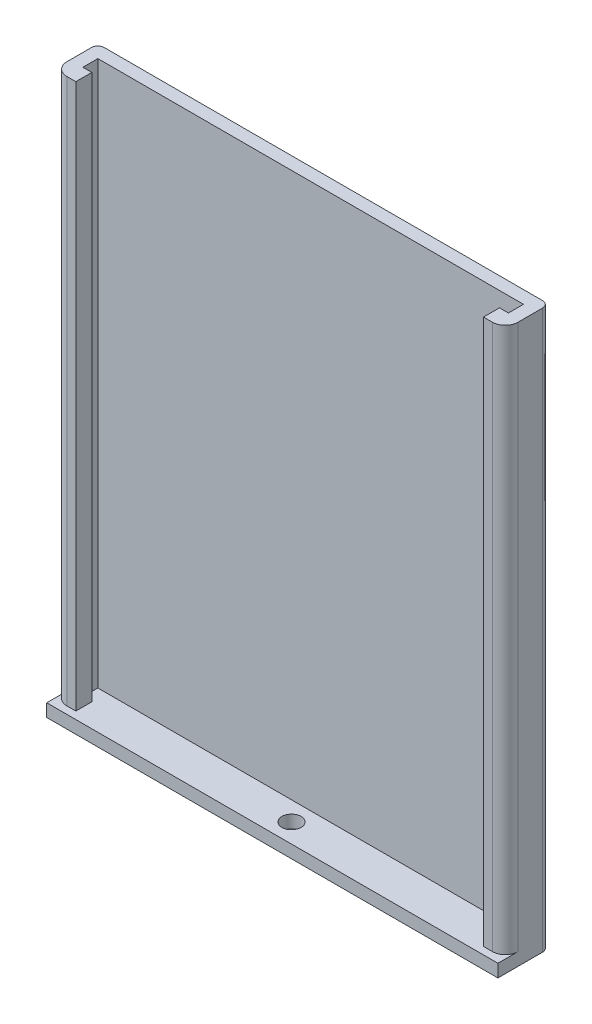
ISO-10303-21;
HEADER;
FILE_DESCRIPTION(('STEP AP214'),'2;1');
FILE_NAME('part.step','',(''),(''),'','','');
FILE_SCHEMA(('AUTOMOTIVE_DESIGN { 1 0 10303 214 1 1 1 1 }'));
ENDSEC;
DATA;
#1=APPLICATION_CONTEXT('core data for automotive mechanical design processes');
#2=APPLICATION_PROTOCOL_DEFINITION('international standard','automotive_design',2000,#1);
#3=PRODUCT_CONTEXT('',#1,'mechanical');
#4=PRODUCT('Part','Part','',(#3));
#5=PRODUCT_RELATED_PRODUCT_CATEGORY('part','',(#4));
#6=PRODUCT_DEFINITION_FORMATION('','',#4);
#7=PRODUCT_DEFINITION_CONTEXT('part definition',#1,'design');
#8=PRODUCT_DEFINITION('design','',#6,#7);
#9=PRODUCT_DEFINITION_SHAPE('','',#8);
#10=(LENGTH_UNIT() NAMED_UNIT(*) SI_UNIT(.MILLI.,.METRE.));
#11=(NAMED_UNIT(*) PLANE_ANGLE_UNIT() SI_UNIT($,.RADIAN.));
#12=(NAMED_UNIT(*) SI_UNIT($,.STERADIAN.) SOLID_ANGLE_UNIT());
#13=UNCERTAINTY_MEASURE_WITH_UNIT(LENGTH_MEASURE(1.E-05),#10,'distance_accuracy_value','');
#14=(GEOMETRIC_REPRESENTATION_CONTEXT(3) GLOBAL_UNCERTAINTY_ASSIGNED_CONTEXT((#13)) GLOBAL_UNIT_ASSIGNED_CONTEXT((#10,
#11,#12)) REPRESENTATION_CONTEXT('',''));
#15=CARTESIAN_POINT('',(0.,0.,0.));
#16=DIRECTION('',(0.,0.,1.));
#17=DIRECTION('',(1.,0.,0.));
#18=AXIS2_PLACEMENT_3D('',#15,#16,#17);
#19=CARTESIAN_POINT('',(0.,83.,2.));
#20=DIRECTION('',(0.,-1.,0.));
#21=DIRECTION('',(0.,0.,-1.));
#22=AXIS2_PLACEMENT_3D('',#19,#20,#21);
#23=PLANE('',#22);
#24=DIRECTION('',(-1.,0.,0.));
#25=VECTOR('',#24,1.);
#26=CARTESIAN_POINT('',(0.,83.,0.));
#27=LINE('',#26,#25);
#28=CARTESIAN_POINT('',(67.6,83.,0.));
#29=VERTEX_POINT('',#28);
#30=CARTESIAN_POINT('',(-0.999999999999993,83.,0.));
#31=VERTEX_POINT('',#30);
#32=EDGE_CURVE('E292',#29,#31,#27,.T.);
#33=ORIENTED_EDGE('',*,*,#32,.T.);
#34=CARTESIAN_POINT('',(-1.,83.,1.));
#35=DIRECTION('',(0.,1.,0.));
#36=DIRECTION('',(0.,0.,-1.));
#37=AXIS2_PLACEMENT_3D('',#34,#35,#36);
#38=CIRCLE('',#37,1.);
#39=CARTESIAN_POINT('',(-2.,83.,1.00000000000001));
#40=VERTEX_POINT('',#39);
#41=EDGE_CURVE('E275',#31,#40,#38,.T.);
#42=ORIENTED_EDGE('',*,*,#41,.T.);
#43=DIRECTION('',(0.,0.,1.));
#44=VECTOR('',#43,1.);
#45=CARTESIAN_POINT('',(-2.,83.,1.00000000000001));
#46=LINE('',#45,#44);
#47=CARTESIAN_POINT('',(-2.,83.,4.84999999999999));
#48=VERTEX_POINT('',#47);
#49=EDGE_CURVE('E160',#40,#48,#46,.T.);
#50=ORIENTED_EDGE('',*,*,#49,.T.);
#51=CARTESIAN_POINT('',(0.,83.,4.85));
#52=DIRECTION('',(0.,1.,0.));
#53=DIRECTION('',(0.,0.,-1.));
#54=AXIS2_PLACEMENT_3D('',#51,#52,#53);
#55=CIRCLE('',#54,2.);
#56=CARTESIAN_POINT('',(0.,83.,6.85));
#57=VERTEX_POINT('',#56);
#58=EDGE_CURVE('E278',#48,#57,#55,.T.);
#59=ORIENTED_EDGE('',*,*,#58,.T.);
#60=DIRECTION('',(1.,0.,0.));
#61=VECTOR('',#60,1.);
#62=CARTESIAN_POINT('',(0.,83.,6.85));
#63=LINE('',#62,#61);
#64=CARTESIAN_POINT('',(1.4,83.,6.85));
#65=VERTEX_POINT('',#64);
#66=EDGE_CURVE('E281',#57,#65,#63,.T.);
#67=ORIENTED_EDGE('',*,*,#66,.T.);
#68=DIRECTION('',(0.,0.,-1.));
#69=VECTOR('',#68,1.);
#70=CARTESIAN_POINT('',(1.4,83.,4.35));
#71=LINE('',#70,#69);
#72=CARTESIAN_POINT('',(1.4,83.,4.35));
#73=VERTEX_POINT('',#72);
#74=EDGE_CURVE('E284',#65,#73,#71,.T.);
#75=ORIENTED_EDGE('',*,*,#74,.T.);
#76=DIRECTION('',(-1.,0.,0.));
#77=VECTOR('',#76,1.);
#78=CARTESIAN_POINT('',(0.,83.,4.35));
#79=LINE('',#78,#77);
#80=CARTESIAN_POINT('',(0.,83.,4.35));
#81=VERTEX_POINT('',#80);
#82=EDGE_CURVE('E287',#73,#81,#79,.T.);
#83=ORIENTED_EDGE('',*,*,#82,.T.);
#84=DIRECTION('',(0.,0.,-1.));
#85=VECTOR('',#84,1.);
#86=CARTESIAN_POINT('',(0.,83.,0.));
#87=LINE('',#86,#85);
#88=CARTESIAN_POINT('',(0.,83.,2.));
#89=VERTEX_POINT('',#88);
#90=EDGE_CURVE('E259',#81,#89,#87,.T.);
#91=ORIENTED_EDGE('',*,*,#90,.T.);
#92=DIRECTION('',(-1.,0.,0.));
#93=VECTOR('',#92,1.);
#94=CARTESIAN_POINT('',(0.,83.,2.));
#95=LINE('',#94,#93);
#96=CARTESIAN_POINT('',(66.6,83.,2.));
#97=VERTEX_POINT('',#96);
#98=EDGE_CURVE('E11',#97,#89,#95,.T.);
#99=ORIENTED_EDGE('',*,*,#98,.F.);
#100=DIRECTION('',(0.,0.,1.));
#101=VECTOR('',#100,1.);
#102=CARTESIAN_POINT('',(66.6,83.,0.));
#103=LINE('',#102,#101);
#104=CARTESIAN_POINT('',(66.6,83.,4.35));
#105=VERTEX_POINT('',#104);
#106=EDGE_CURVE('E239',#97,#105,#103,.T.);
#107=ORIENTED_EDGE('',*,*,#106,.T.);
#108=DIRECTION('',(-1.,0.,0.));
#109=VECTOR('',#108,1.);
#110=CARTESIAN_POINT('',(66.6,83.,4.35));
#111=LINE('',#110,#109);
#112=CARTESIAN_POINT('',(65.2,83.,4.35));
#113=VERTEX_POINT('',#112);
#114=EDGE_CURVE('E241',#105,#113,#111,.T.);
#115=ORIENTED_EDGE('',*,*,#114,.T.);
#116=DIRECTION('',(0.,0.,1.));
#117=VECTOR('',#116,1.);
#118=CARTESIAN_POINT('',(65.2,83.,4.35));
#119=LINE('',#118,#117);
#120=CARTESIAN_POINT('',(65.2,83.,6.85));
#121=VERTEX_POINT('',#120);
#122=EDGE_CURVE('E244',#113,#121,#119,.T.);
#123=ORIENTED_EDGE('',*,*,#122,.T.);
#124=DIRECTION('',(1.,0.,0.));
#125=VECTOR('',#124,1.);
#126=CARTESIAN_POINT('',(66.6,83.,6.85));
#127=LINE('',#126,#125);
#128=CARTESIAN_POINT('',(66.6,83.,6.85));
#129=VERTEX_POINT('',#128);
#130=EDGE_CURVE('E247',#121,#129,#127,.T.);
#131=ORIENTED_EDGE('',*,*,#130,.T.);
#132=CARTESIAN_POINT('',(66.6,83.,4.85));
#133=DIRECTION('',(0.,1.,0.));
#134=DIRECTION('',(0.,0.,1.));
#135=AXIS2_PLACEMENT_3D('',#132,#133,#134);
#136=CIRCLE('',#135,2.);
#137=CARTESIAN_POINT('',(68.6,83.,4.84999999999999));
#138=VERTEX_POINT('',#137);
#139=EDGE_CURVE('E250',#129,#138,#136,.T.);
#140=ORIENTED_EDGE('',*,*,#139,.T.);
#141=DIRECTION('',(0.,0.,-1.));
#142=VECTOR('',#141,1.);
#143=CARTESIAN_POINT('',(68.6,83.,1.00000000000001));
#144=LINE('',#143,#142);
#145=CARTESIAN_POINT('',(68.6,83.,1.00000000000001));
#146=VERTEX_POINT('',#145);
#147=EDGE_CURVE('E253',#138,#146,#144,.T.);
#148=ORIENTED_EDGE('',*,*,#147,.T.);
#149=CARTESIAN_POINT('',(67.6,83.,1.));
#150=DIRECTION('',(0.,1.,0.));
#151=DIRECTION('',(0.,0.,1.));
#152=AXIS2_PLACEMENT_3D('',#149,#150,#151);
#153=CIRCLE('',#152,1.);
#154=EDGE_CURVE('E236',#146,#29,#153,.T.);
#155=ORIENTED_EDGE('',*,*,#154,.T.);
#156=EDGE_LOOP('',(#33,#42,#50,#59,#67,#75,#83,#91,#99,#107,#115,#123,#131,#140,#148,#155));
#157=FACE_BOUND('',#156,.T.);
#158=ADVANCED_FACE('F32',(#157),#23,.F.);
#159=CARTESIAN_POINT('',(0.,0.,2.));
#160=DIRECTION('',(0.,0.,-1.));
#161=DIRECTION('',(-1.,0.,0.));
#162=AXIS2_PLACEMENT_3D('',#159,#160,#161);
#163=PLANE('',#162);
#164=DIRECTION('',(0.,-1.,0.));
#165=VECTOR('',#164,1.);
#166=CARTESIAN_POINT('',(0.,0.,2.));
#167=LINE('',#166,#165);
#168=CARTESIAN_POINT('',(0.,-2.3,2.));
#169=VERTEX_POINT('',#168);
#170=EDGE_CURVE('E301',#89,#169,#167,.T.);
#171=ORIENTED_EDGE('',*,*,#170,.T.);
#172=DIRECTION('',(-1.,0.,0.));
#173=VECTOR('',#172,1.);
#174=CARTESIAN_POINT('',(66.6,-2.3,2.));
#175=LINE('',#174,#173);
#176=CARTESIAN_POINT('',(66.6,-2.3,2.));
#177=VERTEX_POINT('',#176);
#178=EDGE_CURVE('E218',#177,#169,#175,.T.);
#179=ORIENTED_EDGE('',*,*,#178,.F.);
#180=DIRECTION('',(0.,1.,0.));
#181=VECTOR('',#180,1.);
#182=CARTESIAN_POINT('',(66.6,0.,2.));
#183=LINE('',#182,#181);
#184=EDGE_CURVE('E40',#177,#97,#183,.T.);
#185=ORIENTED_EDGE('',*,*,#184,.T.);
#186=ORIENTED_EDGE('',*,*,#98,.T.);
#187=EDGE_LOOP('',(#171,#179,#185,#186));
#188=FACE_BOUND('',#187,.T.);
#189=ADVANCED_FACE('F343',(#188),#163,.F.);
#190=CARTESIAN_POINT('',(0.,0.,0.));
#191=DIRECTION('',(0.,0.,-1.));
#192=DIRECTION('',(-1.,0.,0.));
#193=AXIS2_PLACEMENT_3D('',#190,#191,#192);
#194=PLANE('',#193);
#195=DIRECTION('',(0.,1.,0.));
#196=VECTOR('',#195,1.);
#197=CARTESIAN_POINT('',(67.6,0.,0.));
#198=LINE('',#197,#196);
#199=CARTESIAN_POINT('',(67.6,-4.3,0.));
#200=VERTEX_POINT('',#199);
#201=EDGE_CURVE('E256',#200,#29,#198,.T.);
#202=ORIENTED_EDGE('',*,*,#201,.F.);
#203=DIRECTION('',(1.,0.,0.));
#204=VECTOR('',#203,1.);
#205=CARTESIAN_POINT('',(67.6,-4.3,0.));
#206=LINE('',#205,#204);
#207=CARTESIAN_POINT('',(-0.999999999999995,-4.3,0.));
#208=VERTEX_POINT('',#207);
#209=EDGE_CURVE('E174',#208,#200,#206,.T.);
#210=ORIENTED_EDGE('',*,*,#209,.F.);
#211=DIRECTION('',(0.,1.,0.));
#212=VECTOR('',#211,1.);
#213=CARTESIAN_POINT('',(-0.999999999999993,0.,0.));
#214=LINE('',#213,#212);
#215=EDGE_CURVE('E165',#208,#31,#214,.T.);
#216=ORIENTED_EDGE('',*,*,#215,.T.);
#217=ORIENTED_EDGE('',*,*,#32,.F.);
#218=EDGE_LOOP('',(#202,#210,#216,#217));
#219=FACE_BOUND('',#218,.T.);
#220=ADVANCED_FACE('F306',(#219),#194,.T.);
#221=CARTESIAN_POINT('',(0.,0.,0.));
#222=DIRECTION('',(1.,0.,0.));
#223=DIRECTION('',(0.,0.,-1.));
#224=AXIS2_PLACEMENT_3D('',#221,#222,#223);
#225=PLANE('',#224);
#226=ORIENTED_EDGE('',*,*,#170,.F.);
#227=ORIENTED_EDGE('',*,*,#90,.F.);
#228=DIRECTION('',(0.,1.,0.));
#229=VECTOR('',#228,1.);
#230=CARTESIAN_POINT('',(0.,0.,4.35));
#231=LINE('',#230,#229);
#232=CARTESIAN_POINT('',(0.,-2.3,4.35));
#233=VERTEX_POINT('',#232);
#234=EDGE_CURVE('E290',#233,#81,#231,.T.);
#235=ORIENTED_EDGE('',*,*,#234,.F.);
#236=DIRECTION('',(0.,0.,1.));
#237=VECTOR('',#236,1.);
#238=CARTESIAN_POINT('',(0.,-2.3,2.));
#239=LINE('',#238,#237);
#240=EDGE_CURVE('E221',#169,#233,#239,.T.);
#241=ORIENTED_EDGE('',*,*,#240,.F.);
#242=EDGE_LOOP('',(#226,#227,#235,#241));
#243=FACE_BOUND('',#242,.T.);
#244=ADVANCED_FACE('F341',(#243),#225,.T.);
#245=CARTESIAN_POINT('',(0.,0.,4.35));
#246=DIRECTION('',(0.,0.,-1.));
#247=DIRECTION('',(-1.,0.,0.));
#248=AXIS2_PLACEMENT_3D('',#245,#246,#247);
#249=PLANE('',#248);
#250=ORIENTED_EDGE('',*,*,#82,.F.);
#251=DIRECTION('',(0.,1.,0.));
#252=VECTOR('',#251,1.);
#253=CARTESIAN_POINT('',(1.4,0.,4.35));
#254=LINE('',#253,#252);
#255=CARTESIAN_POINT('',(1.4,-2.3,4.35));
#256=VERTEX_POINT('',#255);
#257=EDGE_CURVE('E293',#256,#73,#254,.T.);
#258=ORIENTED_EDGE('',*,*,#257,.F.);
#259=DIRECTION('',(1.,0.,0.));
#260=VECTOR('',#259,1.);
#261=CARTESIAN_POINT('',(0.,-2.3,4.35));
#262=LINE('',#261,#260);
#263=EDGE_CURVE('E224',#233,#256,#262,.T.);
#264=ORIENTED_EDGE('',*,*,#263,.F.);
#265=ORIENTED_EDGE('',*,*,#234,.T.);
#266=EDGE_LOOP('',(#250,#258,#264,#265));
#267=FACE_BOUND('',#266,.T.);
#268=ADVANCED_FACE('F337',(#267),#249,.T.);
#269=CARTESIAN_POINT('',(1.4,0.,4.35));
#270=DIRECTION('',(1.,0.,0.));
#271=DIRECTION('',(0.,0.,-1.));
#272=AXIS2_PLACEMENT_3D('',#269,#270,#271);
#273=PLANE('',#272);
#274=ORIENTED_EDGE('',*,*,#74,.F.);
#275=DIRECTION('',(0.,1.,0.));
#276=VECTOR('',#275,1.);
#277=CARTESIAN_POINT('',(1.4,0.,6.85));
#278=LINE('',#277,#276);
#279=CARTESIAN_POINT('',(1.4,-2.3,6.85));
#280=VERTEX_POINT('',#279);
#281=EDGE_CURVE('E295',#280,#65,#278,.T.);
#282=ORIENTED_EDGE('',*,*,#281,.F.);
#283=DIRECTION('',(0.,0.,1.));
#284=VECTOR('',#283,1.);
#285=CARTESIAN_POINT('',(1.4,-2.3,4.35));
#286=LINE('',#285,#284);
#287=EDGE_CURVE('E227',#256,#280,#286,.T.);
#288=ORIENTED_EDGE('',*,*,#287,.F.);
#289=ORIENTED_EDGE('',*,*,#257,.T.);
#290=EDGE_LOOP('',(#274,#282,#288,#289));
#291=FACE_BOUND('',#290,.T.);
#292=ADVANCED_FACE('F334',(#291),#273,.T.);
#293=CARTESIAN_POINT('',(0.,0.,6.85));
#294=DIRECTION('',(0.,0.,1.));
#295=DIRECTION('',(1.,0.,0.));
#296=AXIS2_PLACEMENT_3D('',#293,#294,#295);
#297=PLANE('',#296);
#298=ORIENTED_EDGE('',*,*,#66,.F.);
#299=DIRECTION('',(0.,1.,0.));
#300=VECTOR('',#299,1.);
#301=CARTESIAN_POINT('',(0.,0.,6.85));
#302=LINE('',#301,#300);
#303=CARTESIAN_POINT('',(0.,-2.3,6.85));
#304=VERTEX_POINT('',#303);
#305=EDGE_CURVE('E297',#304,#57,#302,.T.);
#306=ORIENTED_EDGE('',*,*,#305,.F.);
#307=DIRECTION('',(-1.,0.,0.));
#308=VECTOR('',#307,1.);
#309=CARTESIAN_POINT('',(1.4,-2.3,6.85));
#310=LINE('',#309,#308);
#311=EDGE_CURVE('E230',#280,#304,#310,.T.);
#312=ORIENTED_EDGE('',*,*,#311,.F.);
#313=ORIENTED_EDGE('',*,*,#281,.T.);
#314=EDGE_LOOP('',(#298,#306,#312,#313));
#315=FACE_BOUND('',#314,.T.);
#316=ADVANCED_FACE('F331',(#315),#297,.T.);
#317=CARTESIAN_POINT('',(0.,0.,4.85));
#318=DIRECTION('',(0.,1.,0.));
#319=DIRECTION('',(0.,0.,1.));
#320=AXIS2_PLACEMENT_3D('',#317,#318,#319);
#321=CYLINDRICAL_SURFACE('',#320,2.);
#322=ORIENTED_EDGE('',*,*,#58,.F.);
#323=DIRECTION('',(0.,1.,0.));
#324=VECTOR('',#323,1.);
#325=CARTESIAN_POINT('',(-2.,0.,4.84999999999999));
#326=LINE('',#325,#324);
#327=CARTESIAN_POINT('',(-2.,-2.3,4.85));
#328=VERTEX_POINT('',#327);
#329=EDGE_CURVE('E164',#328,#48,#326,.T.);
#330=ORIENTED_EDGE('',*,*,#329,.F.);
#331=CARTESIAN_POINT('',(0.,-2.3,4.85));
#332=DIRECTION('',(0.,-1.,0.));
#333=DIRECTION('',(0.,0.,-1.));
#334=AXIS2_PLACEMENT_3D('',#331,#332,#333);
#335=CIRCLE('',#334,2.);
#336=EDGE_CURVE('E233',#304,#328,#335,.T.);
#337=ORIENTED_EDGE('',*,*,#336,.F.);
#338=ORIENTED_EDGE('',*,*,#305,.T.);
#339=EDGE_LOOP('',(#322,#330,#337,#338));
#340=FACE_BOUND('',#339,.T.);
#341=ADVANCED_FACE('F326',(#340),#321,.T.);
#342=CARTESIAN_POINT('',(-2.,0.,1.00000000000001));
#343=DIRECTION('',(-1.,0.,0.));
#344=DIRECTION('',(0.,0.,1.));
#345=AXIS2_PLACEMENT_3D('',#342,#343,#344);
#346=PLANE('',#345);
#347=ORIENTED_EDGE('',*,*,#49,.F.);
#348=DIRECTION('',(0.,1.,0.));
#349=VECTOR('',#348,1.);
#350=CARTESIAN_POINT('',(-2.,0.,1.00000000000001));
#351=LINE('',#350,#349);
#352=CARTESIAN_POINT('',(-2.,-4.3,0.999999999999999));
#353=VERTEX_POINT('',#352);
#354=EDGE_CURVE('E153',#353,#40,#351,.T.);
#355=ORIENTED_EDGE('',*,*,#354,.F.);
#356=DIRECTION('',(0.,0.,-1.));
#357=VECTOR('',#356,1.);
#358=CARTESIAN_POINT('',(-2.,-4.3,0.999999999999999));
#359=LINE('',#358,#357);
#360=CARTESIAN_POINT('',(-2.,-4.3,7.99999999999999));
#361=VERTEX_POINT('',#360);
#362=EDGE_CURVE('E158',#361,#353,#359,.T.);
#363=ORIENTED_EDGE('',*,*,#362,.F.);
#364=DIRECTION('',(0.,1.,0.));
#365=VECTOR('',#364,1.);
#366=CARTESIAN_POINT('',(-2.,-4.3,7.99999999999999));
#367=LINE('',#366,#365);
#368=CARTESIAN_POINT('',(-2.,-2.3,7.99999999999999));
#369=VERTEX_POINT('',#368);
#370=EDGE_CURVE('E194',#361,#369,#367,.T.);
#371=ORIENTED_EDGE('',*,*,#370,.T.);
#372=DIRECTION('',(0.,0.,-1.));
#373=VECTOR('',#372,1.);
#374=CARTESIAN_POINT('',(-2.,-2.3,0.999999999999999));
#375=LINE('',#374,#373);
#376=EDGE_CURVE('E195',#369,#328,#375,.T.);
#377=ORIENTED_EDGE('',*,*,#376,.T.);
#378=ORIENTED_EDGE('',*,*,#329,.T.);
#379=EDGE_LOOP('',(#347,#355,#363,#371,#377,#378));
#380=FACE_BOUND('',#379,.T.);
#381=ADVANCED_FACE('F155',(#380),#346,.T.);
#382=CARTESIAN_POINT('',(-1.,0.,1.));
#383=DIRECTION('',(0.,1.,0.));
#384=DIRECTION('',(0.,0.,1.));
#385=AXIS2_PLACEMENT_3D('',#382,#383,#384);
#386=CYLINDRICAL_SURFACE('',#385,1.);
#387=ORIENTED_EDGE('',*,*,#41,.F.);
#388=ORIENTED_EDGE('',*,*,#215,.F.);
#389=CARTESIAN_POINT('',(-1.,-4.3,0.999999999999991));
#390=DIRECTION('',(0.,-1.,0.));
#391=DIRECTION('',(0.,0.,-1.));
#392=AXIS2_PLACEMENT_3D('',#389,#390,#391);
#393=CIRCLE('',#392,1.);
#394=EDGE_CURVE('E168',#353,#208,#393,.T.);
#395=ORIENTED_EDGE('',*,*,#394,.F.);
#396=ORIENTED_EDGE('',*,*,#354,.T.);
#397=EDGE_LOOP('',(#387,#388,#395,#396));
#398=FACE_BOUND('',#397,.T.);
#399=ADVANCED_FACE('F169',(#398),#386,.T.);
#400=CARTESIAN_POINT('',(66.6,0.,0.));
#401=DIRECTION('',(-1.,0.,0.));
#402=DIRECTION('',(0.,0.,1.));
#403=AXIS2_PLACEMENT_3D('',#400,#401,#402);
#404=PLANE('',#403);
#405=ORIENTED_EDGE('',*,*,#184,.F.);
#406=DIRECTION('',(0.,0.,-1.));
#407=VECTOR('',#406,1.);
#408=CARTESIAN_POINT('',(66.6,-2.3,4.35));
#409=LINE('',#408,#407);
#410=CARTESIAN_POINT('',(66.6,-2.3,4.35));
#411=VERTEX_POINT('',#410);
#412=EDGE_CURVE('E215',#411,#177,#409,.T.);
#413=ORIENTED_EDGE('',*,*,#412,.F.);
#414=DIRECTION('',(0.,1.,0.));
#415=VECTOR('',#414,1.);
#416=CARTESIAN_POINT('',(66.6,0.,4.35));
#417=LINE('',#416,#415);
#418=EDGE_CURVE('E268',#411,#105,#417,.T.);
#419=ORIENTED_EDGE('',*,*,#418,.T.);
#420=ORIENTED_EDGE('',*,*,#106,.F.);
#421=EDGE_LOOP('',(#405,#413,#419,#420));
#422=FACE_BOUND('',#421,.T.);
#423=ADVANCED_FACE('F347',(#422),#404,.T.);
#424=CARTESIAN_POINT('',(67.6,0.,1.));
#425=DIRECTION('',(0.,1.,0.));
#426=DIRECTION('',(0.,0.,1.));
#427=AXIS2_PLACEMENT_3D('',#424,#425,#426);
#428=CYLINDRICAL_SURFACE('',#427,1.);
#429=ORIENTED_EDGE('',*,*,#154,.F.);
#430=DIRECTION('',(0.,1.,0.));
#431=VECTOR('',#430,1.);
#432=CARTESIAN_POINT('',(68.6,0.,1.00000000000001));
#433=LINE('',#432,#431);
#434=CARTESIAN_POINT('',(68.6,-4.3,1.00000000000001));
#435=VERTEX_POINT('',#434);
#436=EDGE_CURVE('E257',#435,#146,#433,.T.);
#437=ORIENTED_EDGE('',*,*,#436,.F.);
#438=CARTESIAN_POINT('',(67.6,-4.3,1.));
#439=DIRECTION('',(0.,-1.,0.));
#440=DIRECTION('',(0.,0.,1.));
#441=AXIS2_PLACEMENT_3D('',#438,#439,#440);
#442=CIRCLE('',#441,1.);
#443=EDGE_CURVE('E188',#200,#435,#442,.T.);
#444=ORIENTED_EDGE('',*,*,#443,.F.);
#445=ORIENTED_EDGE('',*,*,#201,.T.);
#446=EDGE_LOOP('',(#429,#437,#444,#445));
#447=FACE_BOUND('',#446,.T.);
#448=ADVANCED_FACE('F310',(#447),#428,.T.);
#449=CARTESIAN_POINT('',(68.6,0.,1.00000000000001));
#450=DIRECTION('',(1.,0.,0.));
#451=DIRECTION('',(0.,0.,-1.));
#452=AXIS2_PLACEMENT_3D('',#449,#450,#451);
#453=PLANE('',#452);
#454=ORIENTED_EDGE('',*,*,#147,.F.);
#455=DIRECTION('',(0.,1.,0.));
#456=VECTOR('',#455,1.);
#457=CARTESIAN_POINT('',(68.6,0.,4.84999999999999));
#458=LINE('',#457,#456);
#459=CARTESIAN_POINT('',(68.6,-2.3,4.84999999999999));
#460=VERTEX_POINT('',#459);
#461=EDGE_CURVE('E260',#460,#138,#458,.T.);
#462=ORIENTED_EDGE('',*,*,#461,.F.);
#463=DIRECTION('',(0.,0.,1.));
#464=VECTOR('',#463,1.);
#465=CARTESIAN_POINT('',(68.6,-2.3,1.00000000000001));
#466=LINE('',#465,#464);
#467=CARTESIAN_POINT('',(68.6,-2.3,8.));
#468=VERTEX_POINT('',#467);
#469=EDGE_CURVE('E182',#460,#468,#466,.T.);
#470=ORIENTED_EDGE('',*,*,#469,.T.);
#471=DIRECTION('',(0.,1.,0.));
#472=VECTOR('',#471,1.);
#473=CARTESIAN_POINT('',(68.6,-4.3,8.));
#474=LINE('',#473,#472);
#475=CARTESIAN_POINT('',(68.6,-4.3,8.));
#476=VERTEX_POINT('',#475);
#477=EDGE_CURVE('E200',#476,#468,#474,.T.);
#478=ORIENTED_EDGE('',*,*,#477,.F.);
#479=DIRECTION('',(0.,0.,1.));
#480=VECTOR('',#479,1.);
#481=CARTESIAN_POINT('',(68.6,-4.3,1.00000000000001));
#482=LINE('',#481,#480);
#483=EDGE_CURVE('E191',#435,#476,#482,.T.);
#484=ORIENTED_EDGE('',*,*,#483,.F.);
#485=ORIENTED_EDGE('',*,*,#436,.T.);
#486=EDGE_LOOP('',(#454,#462,#470,#478,#484,#485));
#487=FACE_BOUND('',#486,.T.);
#488=ADVANCED_FACE('F313',(#487),#453,.T.);
#489=CARTESIAN_POINT('',(66.6,0.,4.85));
#490=DIRECTION('',(0.,1.,0.));
#491=DIRECTION('',(0.,0.,1.));
#492=AXIS2_PLACEMENT_3D('',#489,#490,#491);
#493=CYLINDRICAL_SURFACE('',#492,2.);
#494=ORIENTED_EDGE('',*,*,#139,.F.);
#495=DIRECTION('',(0.,1.,0.));
#496=VECTOR('',#495,1.);
#497=CARTESIAN_POINT('',(66.6,0.,6.85));
#498=LINE('',#497,#496);
#499=CARTESIAN_POINT('',(66.6,-2.3,6.85));
#500=VERTEX_POINT('',#499);
#501=EDGE_CURVE('E262',#500,#129,#498,.T.);
#502=ORIENTED_EDGE('',*,*,#501,.F.);
#503=CARTESIAN_POINT('',(66.6,-2.3,4.85));
#504=DIRECTION('',(0.,-1.,0.));
#505=DIRECTION('',(0.,0.,-1.));
#506=AXIS2_PLACEMENT_3D('',#503,#504,#505);
#507=CIRCLE('',#506,2.);
#508=EDGE_CURVE('E203',#460,#500,#507,.T.);
#509=ORIENTED_EDGE('',*,*,#508,.F.);
#510=ORIENTED_EDGE('',*,*,#461,.T.);
#511=EDGE_LOOP('',(#494,#502,#509,#510));
#512=FACE_BOUND('',#511,.T.);
#513=ADVANCED_FACE('F361',(#512),#493,.T.);
#514=CARTESIAN_POINT('',(66.6,0.,6.85));
#515=DIRECTION('',(0.,0.,1.));
#516=DIRECTION('',(1.,0.,0.));
#517=AXIS2_PLACEMENT_3D('',#514,#515,#516);
#518=PLANE('',#517);
#519=ORIENTED_EDGE('',*,*,#130,.F.);
#520=DIRECTION('',(0.,1.,0.));
#521=VECTOR('',#520,1.);
#522=CARTESIAN_POINT('',(65.2,0.,6.85));
#523=LINE('',#522,#521);
#524=CARTESIAN_POINT('',(65.2,-2.3,6.85));
#525=VERTEX_POINT('',#524);
#526=EDGE_CURVE('E264',#525,#121,#523,.T.);
#527=ORIENTED_EDGE('',*,*,#526,.F.);
#528=DIRECTION('',(-1.,0.,0.));
#529=VECTOR('',#528,1.);
#530=CARTESIAN_POINT('',(66.6,-2.3,6.85));
#531=LINE('',#530,#529);
#532=EDGE_CURVE('E206',#500,#525,#531,.T.);
#533=ORIENTED_EDGE('',*,*,#532,.F.);
#534=ORIENTED_EDGE('',*,*,#501,.T.);
#535=EDGE_LOOP('',(#519,#527,#533,#534));
#536=FACE_BOUND('',#535,.T.);
#537=ADVANCED_FACE('F358',(#536),#518,.T.);
#538=CARTESIAN_POINT('',(65.2,0.,4.35));
#539=DIRECTION('',(-1.,0.,0.));
#540=DIRECTION('',(0.,0.,1.));
#541=AXIS2_PLACEMENT_3D('',#538,#539,#540);
#542=PLANE('',#541);
#543=ORIENTED_EDGE('',*,*,#122,.F.);
#544=DIRECTION('',(0.,1.,0.));
#545=VECTOR('',#544,1.);
#546=CARTESIAN_POINT('',(65.2,0.,4.35));
#547=LINE('',#546,#545);
#548=CARTESIAN_POINT('',(65.2,-2.3,4.35));
#549=VERTEX_POINT('',#548);
#550=EDGE_CURVE('E266',#549,#113,#547,.T.);
#551=ORIENTED_EDGE('',*,*,#550,.F.);
#552=DIRECTION('',(0.,0.,-1.));
#553=VECTOR('',#552,1.);
#554=CARTESIAN_POINT('',(65.2,-2.3,6.85));
#555=LINE('',#554,#553);
#556=EDGE_CURVE('E209',#525,#549,#555,.T.);
#557=ORIENTED_EDGE('',*,*,#556,.F.);
#558=ORIENTED_EDGE('',*,*,#526,.T.);
#559=EDGE_LOOP('',(#543,#551,#557,#558));
#560=FACE_BOUND('',#559,.T.);
#561=ADVANCED_FACE('F354',(#560),#542,.T.);
#562=CARTESIAN_POINT('',(66.6,0.,4.35));
#563=DIRECTION('',(0.,0.,-1.));
#564=DIRECTION('',(-1.,0.,0.));
#565=AXIS2_PLACEMENT_3D('',#562,#563,#564);
#566=PLANE('',#565);
#567=ORIENTED_EDGE('',*,*,#114,.F.);
#568=ORIENTED_EDGE('',*,*,#418,.F.);
#569=DIRECTION('',(1.,0.,0.));
#570=VECTOR('',#569,1.);
#571=CARTESIAN_POINT('',(65.2,-2.3,4.35));
#572=LINE('',#571,#570);
#573=EDGE_CURVE('E212',#549,#411,#572,.T.);
#574=ORIENTED_EDGE('',*,*,#573,.F.);
#575=ORIENTED_EDGE('',*,*,#550,.T.);
#576=EDGE_LOOP('',(#567,#568,#574,#575));
#577=FACE_BOUND('',#576,.T.);
#578=ADVANCED_FACE('F351',(#577),#566,.T.);
#579=CARTESIAN_POINT('',(68.6,-4.3,8.));
#580=DIRECTION('',(0.,0.,-1.));
#581=DIRECTION('',(-1.,0.,0.));
#582=AXIS2_PLACEMENT_3D('',#579,#580,#581);
#583=PLANE('',#582);
#584=DIRECTION('',(-1.,0.,0.));
#585=VECTOR('',#584,1.);
#586=CARTESIAN_POINT('',(68.6,-2.3,8.));
#587=LINE('',#586,#585);
#588=EDGE_CURVE('E180',#468,#369,#587,.T.);
#589=ORIENTED_EDGE('',*,*,#588,.T.);
#590=ORIENTED_EDGE('',*,*,#370,.F.);
#591=DIRECTION('',(-1.,0.,0.));
#592=VECTOR('',#591,1.);
#593=CARTESIAN_POINT('',(68.6,-4.3,8.));
#594=LINE('',#593,#592);
#595=EDGE_CURVE('E178',#476,#361,#594,.T.);
#596=ORIENTED_EDGE('',*,*,#595,.F.);
#597=ORIENTED_EDGE('',*,*,#477,.T.);
#598=EDGE_LOOP('',(#589,#590,#596,#597));
#599=FACE_BOUND('',#598,.T.);
#600=ADVANCED_FACE('F318',(#599),#583,.F.);
#601=CARTESIAN_POINT('',(67.6,-4.3,1.));
#602=DIRECTION('',(0.,1.,0.));
#603=DIRECTION('',(0.,0.,1.));
#604=AXIS2_PLACEMENT_3D('',#601,#602,#603);
#605=PLANE('',#604);
#606=CARTESIAN_POINT('',(33.3,-4.3,5.));
#607=DIRECTION('',(0.,-1.,0.));
#608=DIRECTION('',(0.,0.,-1.));
#609=AXIS2_PLACEMENT_3D('',#606,#607,#608);
#610=CIRCLE('',#609,1.5);
#611=CARTESIAN_POINT('',(33.3,-4.3,3.49999999999999));
#612=VERTEX_POINT('',#611);
#613=EDGE_CURVE('E185',#612,#612,#610,.T.);
#614=ORIENTED_EDGE('',*,*,#613,.F.);
#615=EDGE_LOOP('',(#614));
#616=FACE_BOUND('',#615,.T.);
#617=ORIENTED_EDGE('',*,*,#362,.T.);
#618=ORIENTED_EDGE('',*,*,#394,.T.);
#619=ORIENTED_EDGE('',*,*,#209,.T.);
#620=ORIENTED_EDGE('',*,*,#443,.T.);
#621=ORIENTED_EDGE('',*,*,#483,.T.);
#622=ORIENTED_EDGE('',*,*,#595,.T.);
#623=EDGE_LOOP('',(#617,#618,#619,#620,#621,#622));
#624=FACE_BOUND('',#623,.T.);
#625=ADVANCED_FACE('F176',(#616,#624),#605,.F.);
#626=CARTESIAN_POINT('',(67.6,-2.3,1.));
#627=DIRECTION('',(0.,1.,0.));
#628=DIRECTION('',(0.,0.,1.));
#629=AXIS2_PLACEMENT_3D('',#626,#627,#628);
#630=PLANE('',#629);
#631=CARTESIAN_POINT('',(33.3,-2.3,5.));
#632=DIRECTION('',(0.,1.,0.));
#633=DIRECTION('',(0.,0.,1.));
#634=AXIS2_PLACEMENT_3D('',#631,#632,#633);
#635=CIRCLE('',#634,1.5);
#636=CARTESIAN_POINT('',(33.3,-2.3,6.5));
#637=VERTEX_POINT('',#636);
#638=EDGE_CURVE('E35',#637,#637,#635,.T.);
#639=ORIENTED_EDGE('',*,*,#638,.F.);
#640=EDGE_LOOP('',(#639));
#641=FACE_BOUND('',#640,.T.);
#642=ORIENTED_EDGE('',*,*,#469,.F.);
#643=ORIENTED_EDGE('',*,*,#508,.T.);
#644=ORIENTED_EDGE('',*,*,#532,.T.);
#645=ORIENTED_EDGE('',*,*,#556,.T.);
#646=ORIENTED_EDGE('',*,*,#573,.T.);
#647=ORIENTED_EDGE('',*,*,#412,.T.);
#648=ORIENTED_EDGE('',*,*,#178,.T.);
#649=ORIENTED_EDGE('',*,*,#240,.T.);
#650=ORIENTED_EDGE('',*,*,#263,.T.);
#651=ORIENTED_EDGE('',*,*,#287,.T.);
#652=ORIENTED_EDGE('',*,*,#311,.T.);
#653=ORIENTED_EDGE('',*,*,#336,.T.);
#654=ORIENTED_EDGE('',*,*,#376,.F.);
#655=ORIENTED_EDGE('',*,*,#588,.F.);
#656=EDGE_LOOP('',(#642,#643,#644,#645,#646,#647,#648,#649,#650,#651,#652,#653,#654,#655));
#657=FACE_BOUND('',#656,.T.);
#658=ADVANCED_FACE('F321',(#641,#657),#630,.T.);
#659=CARTESIAN_POINT('',(33.3,-0.3,5.));
#660=DIRECTION('',(0.,-1.,0.));
#661=DIRECTION('',(0.,0.,-1.));
#662=AXIS2_PLACEMENT_3D('',#659,#660,#661);
#663=CYLINDRICAL_SURFACE('',#662,1.5);
#664=ORIENTED_EDGE('',*,*,#638,.T.);
#665=EDGE_LOOP('',(#664));
#666=FACE_BOUND('',#665,.T.);
#667=ORIENTED_EDGE('',*,*,#613,.T.);
#668=EDGE_LOOP('',(#667));
#669=FACE_BOUND('',#668,.T.);
#670=ADVANCED_FACE('F428',(#666,#669),#663,.F.);
#671=CLOSED_SHELL('',(#158,#189,#220,#244,#268,#292,#316,#341,#381,#399,#423,#448,#488,#513,
#537,#561,#578,#600,#625,#658,#670));
#672=MANIFOLD_SOLID_BREP('B2',#671);
#673=ADVANCED_BREP_SHAPE_REPRESENTATION('',(#18,#672),#14);
#674=SHAPE_DEFINITION_REPRESENTATION(#9,#673);
ENDSEC;
END-ISO-10303-21;
